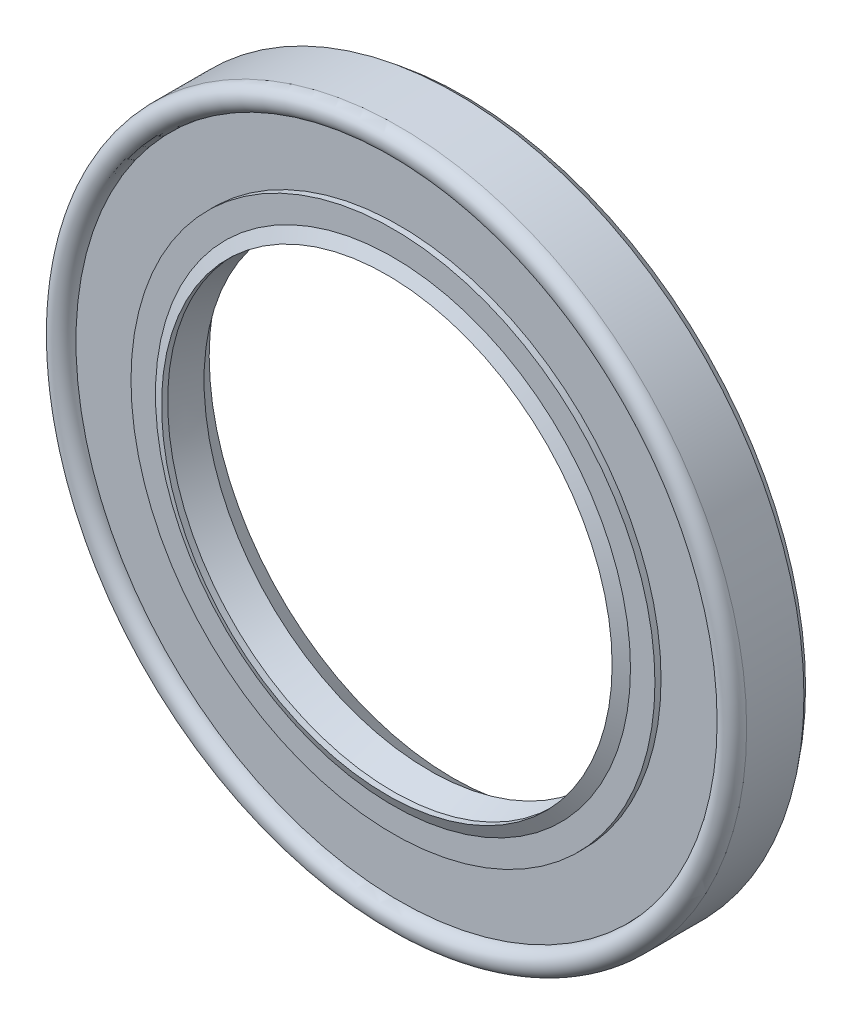
ISO-10303-21;
HEADER;
FILE_DESCRIPTION(('STEP AP214'),'2;1');
FILE_NAME('part.step','',(''),(''),'','','');
FILE_SCHEMA(('AUTOMOTIVE_DESIGN { 1 0 10303 214 1 1 1 1 }'));
ENDSEC;
DATA;
#1=APPLICATION_CONTEXT('core data for automotive mechanical design processes');
#2=APPLICATION_PROTOCOL_DEFINITION('international standard','automotive_design',2000,#1);
#3=PRODUCT_CONTEXT('',#1,'mechanical');
#4=PRODUCT('Part','Part','',(#3));
#5=PRODUCT_RELATED_PRODUCT_CATEGORY('part','',(#4));
#6=PRODUCT_DEFINITION_FORMATION('','',#4);
#7=PRODUCT_DEFINITION_CONTEXT('part definition',#1,'design');
#8=PRODUCT_DEFINITION('design','',#6,#7);
#9=PRODUCT_DEFINITION_SHAPE('','',#8);
#10=(LENGTH_UNIT() NAMED_UNIT(*) SI_UNIT(.MILLI.,.METRE.));
#11=(NAMED_UNIT(*) PLANE_ANGLE_UNIT() SI_UNIT($,.RADIAN.));
#12=(NAMED_UNIT(*) SI_UNIT($,.STERADIAN.) SOLID_ANGLE_UNIT());
#13=UNCERTAINTY_MEASURE_WITH_UNIT(LENGTH_MEASURE(1.E-05),#10,'distance_accuracy_value','');
#14=(GEOMETRIC_REPRESENTATION_CONTEXT(3) GLOBAL_UNCERTAINTY_ASSIGNED_CONTEXT((#13)) GLOBAL_UNIT_ASSIGNED_CONTEXT((#10,
#11,#12)) REPRESENTATION_CONTEXT('',''));
#15=CARTESIAN_POINT('',(0.,0.,0.));
#16=DIRECTION('',(0.,0.,1.));
#17=DIRECTION('',(1.,0.,0.));
#18=AXIS2_PLACEMENT_3D('',#15,#16,#17);
#19=CARTESIAN_POINT('',(0.,0.,-0.125));
#20=DIRECTION('',(0.,0.,1.));
#21=DIRECTION('',(0.,-1.,0.));
#22=AXIS2_PLACEMENT_3D('',#19,#20,#21);
#23=TOROIDAL_SURFACE('',#22,19.4,0.949999999999999);
#24=CARTESIAN_POINT('',(0.,-20.35,-0.124999999999998));
#25=VERTEX_POINT('',#24);
#26=VERTEX_LOOP('',#25);
#27=FACE_BOUND('',#26,.T.);
#28=ADVANCED_FACE('F47',(#27),#23,.T.);
#29=CLOSED_SHELL('',(#28));
#30=MANIFOLD_SOLID_BREP('B2',#29);
#31=CARTESIAN_POINT('',(0.,0.,2.7));
#32=DIRECTION('',(0.,0.,-1.));
#33=DIRECTION('',(-1.,0.,0.));
#34=AXIS2_PLACEMENT_3D('',#31,#32,#33);
#35=CONICAL_SURFACE('',#34,18.45,1.10714871779409);
#36=CARTESIAN_POINT('',(0.,0.,3.175));
#37=DIRECTION('',(0.,0.,1.));
#38=DIRECTION('',(1.,0.,0.));
#39=AXIS2_PLACEMENT_3D('',#36,#37,#38);
#40=CIRCLE('',#39,17.5);
#41=CARTESIAN_POINT('',(17.5,0.,3.175));
#42=VERTEX_POINT('',#41);
#43=EDGE_CURVE('E46',#42,#42,#40,.T.);
#44=ORIENTED_EDGE('',*,*,#43,.F.);
#45=EDGE_LOOP('',(#44));
#46=FACE_BOUND('',#45,.T.);
#47=CARTESIAN_POINT('',(0.,0.,2.7));
#48=DIRECTION('',(0.,0.,1.));
#49=DIRECTION('',(1.,0.,0.));
#50=AXIS2_PLACEMENT_3D('',#47,#48,#49);
#51=CIRCLE('',#50,18.45);
#52=CARTESIAN_POINT('',(18.45,0.,2.7));
#53=VERTEX_POINT('',#52);
#54=EDGE_CURVE('E130',#53,#53,#51,.T.);
#55=ORIENTED_EDGE('',*,*,#54,.T.);
#56=EDGE_LOOP('',(#55));
#57=FACE_BOUND('',#56,.T.);
#58=ADVANCED_FACE('F60',(#46,#57),#35,.T.);
#59=CARTESIAN_POINT('',(0.,0.,-3.175));
#60=DIRECTION('',(0.,0.,1.));
#61=DIRECTION('',(1.,0.,0.));
#62=AXIS2_PLACEMENT_3D('',#59,#60,#61);
#63=CYLINDRICAL_SURFACE('',#62,17.5);
#64=CARTESIAN_POINT('',(0.,0.,2.69999999999999));
#65=DIRECTION('',(0.,0.,1.));
#66=DIRECTION('',(1.,0.,0.));
#67=AXIS2_PLACEMENT_3D('',#64,#65,#66);
#68=CIRCLE('',#67,17.5);
#69=CARTESIAN_POINT('',(17.5,0.,2.69999999999999));
#70=VERTEX_POINT('',#69);
#71=EDGE_CURVE('E66',#70,#70,#68,.T.);
#72=ORIENTED_EDGE('',*,*,#71,.F.);
#73=EDGE_LOOP('',(#72));
#74=FACE_BOUND('',#73,.T.);
#75=ORIENTED_EDGE('',*,*,#43,.T.);
#76=EDGE_LOOP('',(#75));
#77=FACE_BOUND('',#76,.T.);
#78=ADVANCED_FACE('F251',(#74,#77),#63,.F.);
#79=CARTESIAN_POINT('',(0.,0.,2.69999999999999));
#80=DIRECTION('',(0.,0.,-1.));
#81=DIRECTION('',(-1.,0.,0.));
#82=AXIS2_PLACEMENT_3D('',#79,#80,#81);
#83=CONICAL_SURFACE('',#82,17.5,1.10714871779409);
#84=CARTESIAN_POINT('',(0.,0.,2.225));
#85=DIRECTION('',(0.,0.,1.));
#86=DIRECTION('',(1.,0.,0.));
#87=AXIS2_PLACEMENT_3D('',#84,#85,#86);
#88=CIRCLE('',#87,18.45);
#89=CARTESIAN_POINT('',(18.45,0.,2.225));
#90=VERTEX_POINT('',#89);
#91=EDGE_CURVE('E70',#90,#90,#88,.T.);
#92=ORIENTED_EDGE('',*,*,#91,.F.);
#93=EDGE_LOOP('',(#92));
#94=FACE_BOUND('',#93,.T.);
#95=ORIENTED_EDGE('',*,*,#71,.T.);
#96=EDGE_LOOP('',(#95));
#97=FACE_BOUND('',#96,.T.);
#98=ADVANCED_FACE('F246',(#94,#97),#83,.F.);
#99=CARTESIAN_POINT('',(0.,0.,2.225));
#100=DIRECTION('',(0.,0.,1.));
#101=DIRECTION('',(1.,0.,0.));
#102=AXIS2_PLACEMENT_3D('',#99,#100,#101);
#103=CONICAL_SURFACE('',#102,18.45,0.384169364392593);
#104=CARTESIAN_POINT('',(0.,0.,-0.125000000000003));
#105=DIRECTION('',(0.,0.,1.));
#106=DIRECTION('',(1.,0.,0.));
#107=AXIS2_PLACEMENT_3D('',#104,#105,#106);
#108=CIRCLE('',#107,17.5);
#109=CARTESIAN_POINT('',(17.5,0.,-0.125000000000003));
#110=VERTEX_POINT('',#109);
#111=EDGE_CURVE('E74',#110,#110,#108,.T.);
#112=ORIENTED_EDGE('',*,*,#111,.F.);
#113=EDGE_LOOP('',(#112));
#114=FACE_BOUND('',#113,.T.);
#115=ORIENTED_EDGE('',*,*,#91,.T.);
#116=EDGE_LOOP('',(#115));
#117=FACE_BOUND('',#116,.T.);
#118=ADVANCED_FACE('F240',(#114,#117),#103,.F.);
#119=CARTESIAN_POINT('',(0.,0.,-0.125000000000003));
#120=DIRECTION('',(0.,0.,-1.));
#121=DIRECTION('',(-1.,0.,0.));
#122=AXIS2_PLACEMENT_3D('',#119,#120,#121);
#123=CONICAL_SURFACE('',#122,17.5,0.662937105980103);
#124=CARTESIAN_POINT('',(0.,0.,-1.95));
#125=DIRECTION('',(0.,0.,1.));
#126=DIRECTION('',(1.,0.,0.));
#127=AXIS2_PLACEMENT_3D('',#124,#125,#126);
#128=CIRCLE('',#127,18.925);
#129=CARTESIAN_POINT('',(18.925,0.,-1.95));
#130=VERTEX_POINT('',#129);
#131=EDGE_CURVE('E79',#130,#130,#128,.T.);
#132=ORIENTED_EDGE('',*,*,#131,.F.);
#133=EDGE_LOOP('',(#132));
#134=FACE_BOUND('',#133,.T.);
#135=ORIENTED_EDGE('',*,*,#111,.T.);
#136=EDGE_LOOP('',(#135));
#137=FACE_BOUND('',#136,.T.);
#138=ADVANCED_FACE('F234',(#134,#137),#123,.F.);
#139=CARTESIAN_POINT('',(0.,18.925,-1.95));
#140=DIRECTION('',(0.,0.,1.));
#141=DIRECTION('',(1.,0.,0.));
#142=AXIS2_PLACEMENT_3D('',#139,#140,#141);
#143=PLANE('',#142);
#144=CARTESIAN_POINT('',(0.,0.,-1.95));
#145=DIRECTION('',(0.,0.,1.));
#146=DIRECTION('',(1.,0.,0.));
#147=AXIS2_PLACEMENT_3D('',#144,#145,#146);
#148=CIRCLE('',#147,19.4);
#149=CARTESIAN_POINT('',(19.4,0.,-1.95));
#150=VERTEX_POINT('',#149);
#151=EDGE_CURVE('E82',#150,#150,#148,.T.);
#152=ORIENTED_EDGE('',*,*,#151,.F.);
#153=EDGE_LOOP('',(#152));
#154=FACE_BOUND('',#153,.T.);
#155=ORIENTED_EDGE('',*,*,#131,.T.);
#156=EDGE_LOOP('',(#155));
#157=FACE_BOUND('',#156,.T.);
#158=ADVANCED_FACE('F228',(#154,#157),#143,.F.);
#159=CARTESIAN_POINT('',(0.,0.,-3.175));
#160=DIRECTION('',(0.,0.,1.));
#161=DIRECTION('',(1.,0.,0.));
#162=AXIS2_PLACEMENT_3D('',#159,#160,#161);
#163=CYLINDRICAL_SURFACE('',#162,19.4);
#164=CARTESIAN_POINT('',(0.,0.,-1.075));
#165=DIRECTION('',(0.,0.,1.));
#166=DIRECTION('',(1.,0.,0.));
#167=AXIS2_PLACEMENT_3D('',#164,#165,#166);
#168=CIRCLE('',#167,19.4);
#169=CARTESIAN_POINT('',(19.4,0.,-1.075));
#170=VERTEX_POINT('',#169);
#171=EDGE_CURVE('E85',#170,#170,#168,.T.);
#172=ORIENTED_EDGE('',*,*,#171,.F.);
#173=EDGE_LOOP('',(#172));
#174=FACE_BOUND('',#173,.T.);
#175=ORIENTED_EDGE('',*,*,#151,.T.);
#176=EDGE_LOOP('',(#175));
#177=FACE_BOUND('',#176,.T.);
#178=ADVANCED_FACE('F222',(#174,#177),#163,.T.);
#179=CARTESIAN_POINT('',(0.,0.,-0.125000000000002));
#180=DIRECTION('',(0.,0.,1.));
#181=DIRECTION('',(1.,0.,0.));
#182=AXIS2_PLACEMENT_3D('',#179,#180,#181);
#183=TOROIDAL_SURFACE('',#182,19.4,0.949999999999999);
#184=CARTESIAN_POINT('',(0.,0.,0.824999999999997));
#185=DIRECTION('',(0.,0.,1.));
#186=DIRECTION('',(1.,0.,0.));
#187=AXIS2_PLACEMENT_3D('',#184,#185,#186);
#188=CIRCLE('',#187,19.4);
#189=CARTESIAN_POINT('',(19.4,0.,0.824999999999997));
#190=VERTEX_POINT('',#189);
#191=EDGE_CURVE('E88',#190,#190,#188,.T.);
#192=ORIENTED_EDGE('',*,*,#191,.F.);
#193=EDGE_LOOP('',(#192));
#194=FACE_BOUND('',#193,.T.);
#195=ORIENTED_EDGE('',*,*,#171,.T.);
#196=EDGE_LOOP('',(#195));
#197=FACE_BOUND('',#196,.T.);
#198=ADVANCED_FACE('F216',(#194,#197),#183,.F.);
#199=CARTESIAN_POINT('',(0.,0.,-3.175));
#200=DIRECTION('',(0.,0.,1.));
#201=DIRECTION('',(1.,0.,0.));
#202=AXIS2_PLACEMENT_3D('',#199,#200,#201);
#203=CYLINDRICAL_SURFACE('',#202,19.4);
#204=CARTESIAN_POINT('',(0.,0.,1.27500000000001));
#205=DIRECTION('',(0.,0.,1.));
#206=DIRECTION('',(1.,0.,0.));
#207=AXIS2_PLACEMENT_3D('',#204,#205,#206);
#208=CIRCLE('',#207,19.4);
#209=CARTESIAN_POINT('',(19.4,0.,1.27500000000001));
#210=VERTEX_POINT('',#209);
#211=EDGE_CURVE('E91',#210,#210,#208,.T.);
#212=ORIENTED_EDGE('',*,*,#211,.F.);
#213=EDGE_LOOP('',(#212));
#214=FACE_BOUND('',#213,.T.);
#215=ORIENTED_EDGE('',*,*,#191,.T.);
#216=EDGE_LOOP('',(#215));
#217=FACE_BOUND('',#216,.T.);
#218=ADVANCED_FACE('F210',(#214,#217),#203,.T.);
#219=CARTESIAN_POINT('',(0.,19.4,1.27500000000001));
#220=DIRECTION('',(0.,0.,1.));
#221=DIRECTION('',(1.,0.,0.));
#222=AXIS2_PLACEMENT_3D('',#219,#220,#221);
#223=PLANE('',#222);
#224=CARTESIAN_POINT('',(0.,0.,1.27500000000001));
#225=DIRECTION('',(0.,0.,1.));
#226=DIRECTION('',(1.,0.,0.));
#227=AXIS2_PLACEMENT_3D('',#224,#225,#226);
#228=CIRCLE('',#227,26.05);
#229=CARTESIAN_POINT('',(26.05,0.,1.27500000000001));
#230=VERTEX_POINT('',#229);
#231=EDGE_CURVE('E94',#230,#230,#228,.T.);
#232=ORIENTED_EDGE('',*,*,#231,.F.);
#233=EDGE_LOOP('',(#232));
#234=FACE_BOUND('',#233,.T.);
#235=ORIENTED_EDGE('',*,*,#211,.T.);
#236=EDGE_LOOP('',(#235));
#237=FACE_BOUND('',#236,.T.);
#238=ADVANCED_FACE('F204',(#234,#237),#223,.F.);
#239=CARTESIAN_POINT('',(0.,0.,-3.175));
#240=DIRECTION('',(0.,0.,1.));
#241=DIRECTION('',(1.,0.,0.));
#242=AXIS2_PLACEMENT_3D('',#239,#240,#241);
#243=CYLINDRICAL_SURFACE('',#242,26.05);
#244=CARTESIAN_POINT('',(0.,0.,-1.625));
#245=DIRECTION('',(0.,0.,1.));
#246=DIRECTION('',(1.,0.,0.));
#247=AXIS2_PLACEMENT_3D('',#244,#245,#246);
#248=CIRCLE('',#247,26.05);
#249=CARTESIAN_POINT('',(26.05,0.,-1.625));
#250=VERTEX_POINT('',#249);
#251=EDGE_CURVE('E97',#250,#250,#248,.T.);
#252=ORIENTED_EDGE('',*,*,#251,.F.);
#253=EDGE_LOOP('',(#252));
#254=FACE_BOUND('',#253,.T.);
#255=ORIENTED_EDGE('',*,*,#231,.T.);
#256=EDGE_LOOP('',(#255));
#257=FACE_BOUND('',#256,.T.);
#258=ADVANCED_FACE('F198',(#254,#257),#243,.F.);
#259=CARTESIAN_POINT('',(0.,26.05,-1.625));
#260=DIRECTION('',(0.,0.,1.));
#261=DIRECTION('',(1.,0.,0.));
#262=AXIS2_PLACEMENT_3D('',#259,#260,#261);
#263=PLANE('',#262);
#264=CARTESIAN_POINT('',(0.,0.,-1.625));
#265=DIRECTION('',(0.,0.,1.));
#266=DIRECTION('',(1.,0.,0.));
#267=AXIS2_PLACEMENT_3D('',#264,#265,#266);
#268=CIRCLE('',#267,26.2875);
#269=CARTESIAN_POINT('',(26.2875,0.,-1.625));
#270=VERTEX_POINT('',#269);
#271=EDGE_CURVE('E100',#270,#270,#268,.T.);
#272=ORIENTED_EDGE('',*,*,#271,.F.);
#273=EDGE_LOOP('',(#272));
#274=FACE_BOUND('',#273,.T.);
#275=ORIENTED_EDGE('',*,*,#251,.T.);
#276=EDGE_LOOP('',(#275));
#277=FACE_BOUND('',#276,.T.);
#278=ADVANCED_FACE('F192',(#274,#277),#263,.F.);
#279=CARTESIAN_POINT('',(0.,0.,-3.175));
#280=DIRECTION('',(0.,0.,1.));
#281=DIRECTION('',(1.,0.,0.));
#282=AXIS2_PLACEMENT_3D('',#279,#280,#281);
#283=CYLINDRICAL_SURFACE('',#282,26.2875);
#284=CARTESIAN_POINT('',(0.,0.,-2.225));
#285=DIRECTION('',(0.,0.,1.));
#286=DIRECTION('',(1.,0.,0.));
#287=AXIS2_PLACEMENT_3D('',#284,#285,#286);
#288=CIRCLE('',#287,26.2875);
#289=CARTESIAN_POINT('',(26.2875,0.,-2.225));
#290=VERTEX_POINT('',#289);
#291=EDGE_CURVE('E103',#290,#290,#288,.T.);
#292=ORIENTED_EDGE('',*,*,#291,.F.);
#293=EDGE_LOOP('',(#292));
#294=FACE_BOUND('',#293,.T.);
#295=ORIENTED_EDGE('',*,*,#271,.T.);
#296=EDGE_LOOP('',(#295));
#297=FACE_BOUND('',#296,.T.);
#298=ADVANCED_FACE('F186',(#294,#297),#283,.F.);
#299=CARTESIAN_POINT('',(0.,26.2875,-2.225));
#300=DIRECTION('',(0.,0.,-1.));
#301=DIRECTION('',(-1.,0.,0.));
#302=AXIS2_PLACEMENT_3D('',#299,#300,#301);
#303=PLANE('',#302);
#304=CARTESIAN_POINT('',(0.,0.,-2.225));
#305=DIRECTION('',(0.,0.,1.));
#306=DIRECTION('',(1.,0.,0.));
#307=AXIS2_PLACEMENT_3D('',#304,#305,#306);
#308=CIRCLE('',#307,26.05);
#309=CARTESIAN_POINT('',(26.05,0.,-2.225));
#310=VERTEX_POINT('',#309);
#311=EDGE_CURVE('E106',#310,#310,#308,.T.);
#312=ORIENTED_EDGE('',*,*,#311,.F.);
#313=EDGE_LOOP('',(#312));
#314=FACE_BOUND('',#313,.T.);
#315=ORIENTED_EDGE('',*,*,#291,.T.);
#316=EDGE_LOOP('',(#315));
#317=FACE_BOUND('',#316,.T.);
#318=ADVANCED_FACE('F180',(#314,#317),#303,.F.);
#319=CARTESIAN_POINT('',(0.,0.,-3.175));
#320=DIRECTION('',(0.,0.,1.));
#321=DIRECTION('',(1.,0.,0.));
#322=AXIS2_PLACEMENT_3D('',#319,#320,#321);
#323=CYLINDRICAL_SURFACE('',#322,26.05);
#324=CARTESIAN_POINT('',(0.,0.,-2.825));
#325=DIRECTION('',(0.,0.,1.));
#326=DIRECTION('',(1.,0.,0.));
#327=AXIS2_PLACEMENT_3D('',#324,#325,#326);
#328=CIRCLE('',#327,26.05);
#329=CARTESIAN_POINT('',(26.05,0.,-2.825));
#330=VERTEX_POINT('',#329);
#331=EDGE_CURVE('E109',#330,#330,#328,.T.);
#332=ORIENTED_EDGE('',*,*,#331,.F.);
#333=EDGE_LOOP('',(#332));
#334=FACE_BOUND('',#333,.T.);
#335=ORIENTED_EDGE('',*,*,#311,.T.);
#336=EDGE_LOOP('',(#335));
#337=FACE_BOUND('',#336,.T.);
#338=ADVANCED_FACE('F174',(#334,#337),#323,.F.);
#339=CARTESIAN_POINT('',(0.,26.05,-2.825));
#340=DIRECTION('',(0.,0.,1.));
#341=DIRECTION('',(1.,0.,0.));
#342=AXIS2_PLACEMENT_3D('',#339,#340,#341);
#343=PLANE('',#342);
#344=CARTESIAN_POINT('',(0.,0.,-2.825));
#345=DIRECTION('',(0.,0.,1.));
#346=DIRECTION('',(1.,0.,0.));
#347=AXIS2_PLACEMENT_3D('',#344,#345,#346);
#348=CIRCLE('',#347,26.525);
#349=CARTESIAN_POINT('',(26.525,0.,-2.825));
#350=VERTEX_POINT('',#349);
#351=EDGE_CURVE('E112',#350,#350,#348,.T.);
#352=ORIENTED_EDGE('',*,*,#351,.F.);
#353=EDGE_LOOP('',(#352));
#354=FACE_BOUND('',#353,.T.);
#355=ORIENTED_EDGE('',*,*,#331,.T.);
#356=EDGE_LOOP('',(#355));
#357=FACE_BOUND('',#356,.T.);
#358=ADVANCED_FACE('F168',(#354,#357),#343,.F.);
#359=CARTESIAN_POINT('',(0.,0.,-2.825));
#360=DIRECTION('',(0.,0.,1.));
#361=DIRECTION('',(1.,0.,0.));
#362=AXIS2_PLACEMENT_3D('',#359,#360,#361);
#363=CONICAL_SURFACE('',#362,26.525,0.669638945676608);
#364=CARTESIAN_POINT('',(0.,0.,-2.225));
#365=DIRECTION('',(0.,0.,1.));
#366=DIRECTION('',(1.,0.,0.));
#367=AXIS2_PLACEMENT_3D('',#364,#365,#366);
#368=CIRCLE('',#367,27.);
#369=CARTESIAN_POINT('',(27.,0.,-2.225));
#370=VERTEX_POINT('',#369);
#371=EDGE_CURVE('E115',#370,#370,#368,.T.);
#372=ORIENTED_EDGE('',*,*,#371,.F.);
#373=EDGE_LOOP('',(#372));
#374=FACE_BOUND('',#373,.T.);
#375=ORIENTED_EDGE('',*,*,#351,.T.);
#376=EDGE_LOOP('',(#375));
#377=FACE_BOUND('',#376,.T.);
#378=ADVANCED_FACE('F162',(#374,#377),#363,.T.);
#379=CARTESIAN_POINT('',(0.,0.,-3.175));
#380=DIRECTION('',(0.,0.,1.));
#381=DIRECTION('',(1.,0.,0.));
#382=AXIS2_PLACEMENT_3D('',#379,#380,#381);
#383=CYLINDRICAL_SURFACE('',#382,27.);
#384=CARTESIAN_POINT('',(0.,0.,2.225));
#385=DIRECTION('',(0.,0.,1.));
#386=DIRECTION('',(1.,0.,0.));
#387=AXIS2_PLACEMENT_3D('',#384,#385,#386);
#388=CIRCLE('',#387,27.);
#389=CARTESIAN_POINT('',(27.,0.,2.225));
#390=VERTEX_POINT('',#389);
#391=EDGE_CURVE('E118',#390,#390,#388,.T.);
#392=ORIENTED_EDGE('',*,*,#391,.F.);
#393=EDGE_LOOP('',(#392));
#394=FACE_BOUND('',#393,.T.);
#395=ORIENTED_EDGE('',*,*,#371,.T.);
#396=EDGE_LOOP('',(#395));
#397=FACE_BOUND('',#396,.T.);
#398=ADVANCED_FACE('F156',(#394,#397),#383,.T.);
#399=CARTESIAN_POINT('',(0.,0.,2.225));
#400=DIRECTION('',(0.,0.,1.));
#401=DIRECTION('',(1.,0.,0.));
#402=AXIS2_PLACEMENT_3D('',#399,#400,#401);
#403=TOROIDAL_SURFACE('',#402,26.05,0.949999999999993);
#404=CARTESIAN_POINT('',(0.,0.,2.225));
#405=DIRECTION('',(0.,0.,1.));
#406=DIRECTION('',(1.,0.,0.));
#407=AXIS2_PLACEMENT_3D('',#404,#405,#406);
#408=CIRCLE('',#407,25.1);
#409=CARTESIAN_POINT('',(25.1,0.,2.225));
#410=VERTEX_POINT('',#409);
#411=EDGE_CURVE('E121',#410,#410,#408,.T.);
#412=ORIENTED_EDGE('',*,*,#411,.F.);
#413=EDGE_LOOP('',(#412));
#414=FACE_BOUND('',#413,.T.);
#415=ORIENTED_EDGE('',*,*,#391,.T.);
#416=EDGE_LOOP('',(#415));
#417=FACE_BOUND('',#416,.T.);
#418=ADVANCED_FACE('F150',(#414,#417),#403,.T.);
#419=CARTESIAN_POINT('',(0.,25.1,2.225));
#420=DIRECTION('',(0.,0.,-1.));
#421=DIRECTION('',(-1.,0.,0.));
#422=AXIS2_PLACEMENT_3D('',#419,#420,#421);
#423=PLANE('',#422);
#424=CARTESIAN_POINT('',(0.,0.,2.22500000000001));
#425=DIRECTION('',(0.,0.,1.));
#426=DIRECTION('',(1.,0.,0.));
#427=AXIS2_PLACEMENT_3D('',#424,#425,#426);
#428=CIRCLE('',#427,20.35);
#429=CARTESIAN_POINT('',(20.35,0.,2.22500000000001));
#430=VERTEX_POINT('',#429);
#431=EDGE_CURVE('E124',#430,#430,#428,.T.);
#432=ORIENTED_EDGE('',*,*,#431,.F.);
#433=EDGE_LOOP('',(#432));
#434=FACE_BOUND('',#433,.T.);
#435=ORIENTED_EDGE('',*,*,#411,.T.);
#436=EDGE_LOOP('',(#435));
#437=FACE_BOUND('',#436,.T.);
#438=ADVANCED_FACE('F144',(#434,#437),#423,.F.);
#439=CARTESIAN_POINT('',(0.,0.,-3.175));
#440=DIRECTION('',(0.,0.,1.));
#441=DIRECTION('',(1.,0.,0.));
#442=AXIS2_PLACEMENT_3D('',#439,#440,#441);
#443=CYLINDRICAL_SURFACE('',#442,20.35);
#444=CARTESIAN_POINT('',(0.,0.,2.7));
#445=DIRECTION('',(0.,0.,1.));
#446=DIRECTION('',(1.,0.,0.));
#447=AXIS2_PLACEMENT_3D('',#444,#445,#446);
#448=CIRCLE('',#447,20.35);
#449=CARTESIAN_POINT('',(20.35,0.,2.7));
#450=VERTEX_POINT('',#449);
#451=EDGE_CURVE('E127',#450,#450,#448,.T.);
#452=ORIENTED_EDGE('',*,*,#451,.F.);
#453=EDGE_LOOP('',(#452));
#454=FACE_BOUND('',#453,.T.);
#455=ORIENTED_EDGE('',*,*,#431,.T.);
#456=EDGE_LOOP('',(#455));
#457=FACE_BOUND('',#456,.T.);
#458=ADVANCED_FACE('F138',(#454,#457),#443,.T.);
#459=CARTESIAN_POINT('',(0.,20.35,2.7));
#460=DIRECTION('',(0.,0.,-1.));
#461=DIRECTION('',(-1.,0.,0.));
#462=AXIS2_PLACEMENT_3D('',#459,#460,#461);
#463=PLANE('',#462);
#464=ORIENTED_EDGE('',*,*,#54,.F.);
#465=EDGE_LOOP('',(#464));
#466=FACE_BOUND('',#465,.T.);
#467=ORIENTED_EDGE('',*,*,#451,.T.);
#468=EDGE_LOOP('',(#467));
#469=FACE_BOUND('',#468,.T.);
#470=ADVANCED_FACE('F135',(#466,#469),#463,.F.);
#471=CLOSED_SHELL('',(#58,#78,#98,#118,#138,#158,#178,#198,#218,#238,#258,#278,#298,#318,#338,
#358,#378,#398,#418,#438,#458,#470));
#472=MANIFOLD_SOLID_BREP('B6',#471);
#473=ADVANCED_BREP_SHAPE_REPRESENTATION('',(#18,#30,#472),#14);
#474=SHAPE_DEFINITION_REPRESENTATION(#9,#473);
ENDSEC;
END-ISO-10303-21;
